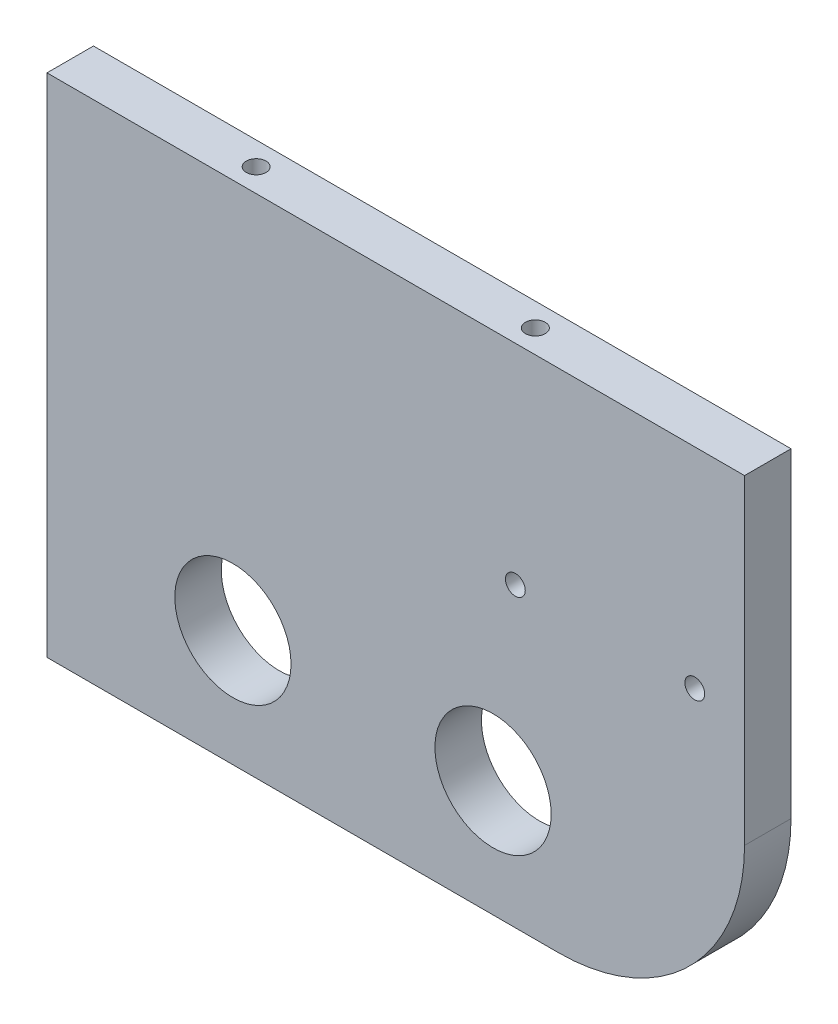
ISO-10303-21;
HEADER;
FILE_DESCRIPTION(('STEP AP214'),'2;1');
FILE_NAME('part.step','',(''),(''),'','','');
FILE_SCHEMA(('AUTOMOTIVE_DESIGN { 1 0 10303 214 1 1 1 1 }'));
ENDSEC;
DATA;
#1=APPLICATION_CONTEXT('core data for automotive mechanical design processes');
#2=APPLICATION_PROTOCOL_DEFINITION('international standard','automotive_design',2000,#1);
#3=PRODUCT_CONTEXT('',#1,'mechanical');
#4=PRODUCT('Part','Part','',(#3));
#5=PRODUCT_RELATED_PRODUCT_CATEGORY('part','',(#4));
#6=PRODUCT_DEFINITION_FORMATION('','',#4);
#7=PRODUCT_DEFINITION_CONTEXT('part definition',#1,'design');
#8=PRODUCT_DEFINITION('design','',#6,#7);
#9=PRODUCT_DEFINITION_SHAPE('','',#8);
#10=(LENGTH_UNIT() NAMED_UNIT(*) SI_UNIT(.MILLI.,.METRE.));
#11=(NAMED_UNIT(*) PLANE_ANGLE_UNIT() SI_UNIT($,.RADIAN.));
#12=(NAMED_UNIT(*) SI_UNIT($,.STERADIAN.) SOLID_ANGLE_UNIT());
#13=UNCERTAINTY_MEASURE_WITH_UNIT(LENGTH_MEASURE(1.E-05),#10,'distance_accuracy_value','');
#14=(GEOMETRIC_REPRESENTATION_CONTEXT(3) GLOBAL_UNCERTAINTY_ASSIGNED_CONTEXT((#13)) GLOBAL_UNIT_ASSIGNED_CONTEXT((#10,
#11,#12)) REPRESENTATION_CONTEXT('',''));
#15=CARTESIAN_POINT('',(0.,0.,0.));
#16=DIRECTION('',(0.,0.,1.));
#17=DIRECTION('',(1.,0.,0.));
#18=AXIS2_PLACEMENT_3D('',#15,#16,#17);
#19=CARTESIAN_POINT('',(-60.9331378268646,-15.875,-101.389403682228));
#20=DIRECTION('',(0.,-1.,0.));
#21=DIRECTION('',(0.,0.,-1.));
#22=AXIS2_PLACEMENT_3D('',#19,#20,#21);
#23=PLANE('',#22);
#24=DIRECTION('',(1.,0.,0.));
#25=VECTOR('',#24,1.);
#26=CARTESIAN_POINT('',(-60.9331378268646,-15.875,-101.389403682228));
#27=LINE('',#26,#25);
#28=CARTESIAN_POINT('',(-60.9331378268646,-15.875,-101.389403682228));
#29=VERTEX_POINT('',#28);
#30=CARTESIAN_POINT('',(8.954322218472,-15.875,-101.389403682228));
#31=VERTEX_POINT('',#30);
#32=EDGE_CURVE('E153',#29,#31,#27,.T.);
#33=ORIENTED_EDGE('',*,*,#32,.T.);
#34=DIRECTION('',(0.,0.,1.));
#35=VECTOR('',#34,1.);
#36=CARTESIAN_POINT('',(8.954322218472,-15.875,-101.389403682228));
#37=LINE('',#36,#35);
#38=CARTESIAN_POINT('',(8.954322218472,-15.875,-95.0394036822282));
#39=VERTEX_POINT('',#38);
#40=EDGE_CURVE('E176',#31,#39,#37,.T.);
#41=ORIENTED_EDGE('',*,*,#40,.T.);
#42=DIRECTION('',(1.,0.,0.));
#43=VECTOR('',#42,1.);
#44=CARTESIAN_POINT('',(-60.9331378268646,-15.875,-95.0394036822282));
#45=LINE('',#44,#43);
#46=CARTESIAN_POINT('',(-60.9331378268646,-15.875,-95.0394036822282));
#47=VERTEX_POINT('',#46);
#48=EDGE_CURVE('E150',#47,#39,#45,.T.);
#49=ORIENTED_EDGE('',*,*,#48,.F.);
#50=DIRECTION('',(0.,0.,1.));
#51=VECTOR('',#50,1.);
#52=CARTESIAN_POINT('',(-60.9331378268646,-15.875,-101.389403682228));
#53=LINE('',#52,#51);
#54=EDGE_CURVE('E174',#29,#47,#53,.T.);
#55=ORIENTED_EDGE('',*,*,#54,.F.);
#56=EDGE_LOOP('',(#33,#41,#49,#55));
#57=FACE_BOUND('',#56,.T.);
#58=ADVANCED_FACE('F40',(#57),#23,.T.);
#59=CARTESIAN_POINT('',(-60.9331378268646,-15.875,-101.389403682228));
#60=DIRECTION('',(-1.,0.,0.));
#61=DIRECTION('',(0.,0.,1.));
#62=AXIS2_PLACEMENT_3D('',#59,#60,#61);
#63=PLANE('',#62);
#64=CARTESIAN_POINT('',(-60.9331378268646,45.340967801772,-98.2144036822282));
#65=DIRECTION('',(-1.,0.,0.));
#66=DIRECTION('',(0.,0.,1.));
#67=AXIS2_PLACEMENT_3D('',#64,#65,#66);
#68=CIRCLE('',#67,1.35254999999999);
#69=CARTESIAN_POINT('',(-60.9331378268646,45.340967801772,-96.8618536822282));
#70=VERTEX_POINT('',#69);
#71=EDGE_CURVE('E106',#70,#70,#68,.T.);
#72=ORIENTED_EDGE('',*,*,#71,.F.);
#73=EDGE_LOOP('',(#72));
#74=FACE_BOUND('',#73,.T.);
#75=CARTESIAN_POINT('',(-60.9331378268646,6.35,-98.2144036822282));
#76=DIRECTION('',(-1.,0.,0.));
#77=DIRECTION('',(0.,0.,1.));
#78=AXIS2_PLACEMENT_3D('',#75,#76,#77);
#79=CIRCLE('',#78,1.35254999999999);
#80=CARTESIAN_POINT('',(-60.9331378268646,6.35,-96.8618536822282));
#81=VERTEX_POINT('',#80);
#82=EDGE_CURVE('E105',#81,#81,#79,.T.);
#83=ORIENTED_EDGE('',*,*,#82,.F.);
#84=EDGE_LOOP('',(#83));
#85=FACE_BOUND('',#84,.T.);
#86=DIRECTION('',(0.,-1.,0.));
#87=VECTOR('',#86,1.);
#88=CARTESIAN_POINT('',(-60.9331378268646,-15.875,-95.0394036822282));
#89=LINE('',#88,#87);
#90=CARTESIAN_POINT('',(-60.9331378268646,53.278467801772,-95.0394036822282));
#91=VERTEX_POINT('',#90);
#92=EDGE_CURVE('E157',#91,#47,#89,.T.);
#93=ORIENTED_EDGE('',*,*,#92,.F.);
#94=DIRECTION('',(0.,0.,1.));
#95=VECTOR('',#94,1.);
#96=CARTESIAN_POINT('',(-60.9331378268646,53.278467801772,-101.389403682228));
#97=LINE('',#96,#95);
#98=CARTESIAN_POINT('',(-60.9331378268646,53.278467801772,-101.389403682228));
#99=VERTEX_POINT('',#98);
#100=EDGE_CURVE('E177',#99,#91,#97,.T.);
#101=ORIENTED_EDGE('',*,*,#100,.F.);
#102=DIRECTION('',(0.,-1.,0.));
#103=VECTOR('',#102,1.);
#104=CARTESIAN_POINT('',(-60.9331378268646,-15.875,-101.389403682228));
#105=LINE('',#104,#103);
#106=EDGE_CURVE('E162',#99,#29,#105,.T.);
#107=ORIENTED_EDGE('',*,*,#106,.T.);
#108=ORIENTED_EDGE('',*,*,#54,.T.);
#109=EDGE_LOOP('',(#93,#101,#107,#108));
#110=FACE_BOUND('',#109,.T.);
#111=ADVANCED_FACE('F193',(#74,#85,#110),#63,.T.);
#112=CARTESIAN_POINT('',(-60.9331378268646,53.278467801772,-101.389403682228));
#113=DIRECTION('',(0.,1.,0.));
#114=DIRECTION('',(0.,0.,1.));
#115=AXIS2_PLACEMENT_3D('',#112,#113,#114);
#116=PLANE('',#115);
#117=CARTESIAN_POINT('',(-35.5331378268646,53.278467801772,-98.2144036822282));
#118=DIRECTION('',(0.,1.,0.));
#119=DIRECTION('',(0.,0.,1.));
#120=AXIS2_PLACEMENT_3D('',#117,#118,#119);
#121=CIRCLE('',#120,1.35254999999999);
#122=CARTESIAN_POINT('',(-35.5331378268646,53.278467801772,-96.8618536822282));
#123=VERTEX_POINT('',#122);
#124=EDGE_CURVE('E116',#123,#123,#121,.T.);
#125=ORIENTED_EDGE('',*,*,#124,.F.);
#126=EDGE_LOOP('',(#125));
#127=FACE_BOUND('',#126,.T.);
#128=CARTESIAN_POINT('',(2.604322218472,53.278467801772,-98.2144036822282));
#129=DIRECTION('',(0.,1.,0.));
#130=DIRECTION('',(0.,0.,1.));
#131=AXIS2_PLACEMENT_3D('',#128,#129,#130);
#132=CIRCLE('',#131,1.35254999999999);
#133=CARTESIAN_POINT('',(2.604322218472,53.278467801772,-96.8618536822282));
#134=VERTEX_POINT('',#133);
#135=EDGE_CURVE('E122',#134,#134,#132,.T.);
#136=ORIENTED_EDGE('',*,*,#135,.F.);
#137=EDGE_LOOP('',(#136));
#138=FACE_BOUND('',#137,.T.);
#139=DIRECTION('',(-1.,0.,0.));
#140=VECTOR('',#139,1.);
#141=CARTESIAN_POINT('',(-60.9331378268646,53.278467801772,-95.0394036822282));
#142=LINE('',#141,#140);
#143=CARTESIAN_POINT('',(34.354322218472,53.278467801772,-95.0394036822282));
#144=VERTEX_POINT('',#143);
#145=EDGE_CURVE('E169',#144,#91,#142,.T.);
#146=ORIENTED_EDGE('',*,*,#145,.F.);
#147=DIRECTION('',(0.,0.,1.));
#148=VECTOR('',#147,1.);
#149=CARTESIAN_POINT('',(34.354322218472,53.278467801772,-101.389403682228));
#150=LINE('',#149,#148);
#151=CARTESIAN_POINT('',(34.354322218472,53.278467801772,-101.389403682228));
#152=VERTEX_POINT('',#151);
#153=EDGE_CURVE('E165',#152,#144,#150,.T.);
#154=ORIENTED_EDGE('',*,*,#153,.F.);
#155=DIRECTION('',(-1.,0.,0.));
#156=VECTOR('',#155,1.);
#157=CARTESIAN_POINT('',(-60.9331378268646,53.278467801772,-101.389403682228));
#158=LINE('',#157,#156);
#159=EDGE_CURVE('E159',#152,#99,#158,.T.);
#160=ORIENTED_EDGE('',*,*,#159,.T.);
#161=ORIENTED_EDGE('',*,*,#100,.T.);
#162=EDGE_LOOP('',(#146,#154,#160,#161));
#163=FACE_BOUND('',#162,.T.);
#164=ADVANCED_FACE('F215',(#127,#138,#163),#116,.T.);
#165=CARTESIAN_POINT('',(34.354322218472,-15.875,-101.389403682228));
#166=DIRECTION('',(1.,0.,0.));
#167=DIRECTION('',(0.,0.,-1.));
#168=AXIS2_PLACEMENT_3D('',#165,#166,#167);
#169=PLANE('',#168);
#170=DIRECTION('',(0.,1.,0.));
#171=VECTOR('',#170,1.);
#172=CARTESIAN_POINT('',(34.354322218472,-15.875,-95.0394036822282));
#173=LINE('',#172,#171);
#174=CARTESIAN_POINT('',(34.354322218472,9.525,-95.0394036822282));
#175=VERTEX_POINT('',#174);
#176=EDGE_CURVE('E167',#175,#144,#173,.T.);
#177=ORIENTED_EDGE('',*,*,#176,.F.);
#178=DIRECTION('',(0.,0.,1.));
#179=VECTOR('',#178,1.);
#180=CARTESIAN_POINT('',(34.354322218472,9.525,-101.389403682228));
#181=LINE('',#180,#179);
#182=CARTESIAN_POINT('',(34.354322218472,9.525,-101.389403682228));
#183=VERTEX_POINT('',#182);
#184=EDGE_CURVE('E48',#175,#183,#181,.F.);
#185=ORIENTED_EDGE('',*,*,#184,.T.);
#186=DIRECTION('',(0.,1.,0.));
#187=VECTOR('',#186,1.);
#188=CARTESIAN_POINT('',(34.354322218472,-15.875,-101.389403682228));
#189=LINE('',#188,#187);
#190=EDGE_CURVE('E156',#183,#152,#189,.T.);
#191=ORIENTED_EDGE('',*,*,#190,.T.);
#192=ORIENTED_EDGE('',*,*,#153,.T.);
#193=EDGE_LOOP('',(#177,#185,#191,#192));
#194=FACE_BOUND('',#193,.T.);
#195=ADVANCED_FACE('F219',(#194),#169,.T.);
#196=CARTESIAN_POINT('',(0.,0.,-101.389403682228));
#197=DIRECTION('',(0.,0.,1.));
#198=DIRECTION('',(1.,0.,0.));
#199=AXIS2_PLACEMENT_3D('',#196,#197,#198);
#200=PLANE('',#199);
#201=CARTESIAN_POINT('',(27.559822218472,24.703467801772,-101.389403682228));
#202=DIRECTION('',(0.,0.,1.));
#203=DIRECTION('',(1.,0.,0.));
#204=AXIS2_PLACEMENT_3D('',#201,#202,#203);
#205=CIRCLE('',#204,1.35254999999999);
#206=CARTESIAN_POINT('',(28.912372218472,24.703467801772,-101.389403682228));
#207=VERTEX_POINT('',#206);
#208=EDGE_CURVE('E131',#207,#207,#205,.T.);
#209=ORIENTED_EDGE('',*,*,#208,.T.);
#210=EDGE_LOOP('',(#209));
#211=FACE_BOUND('',#210,.T.);
#212=CARTESIAN_POINT('',(3.04882221847201,24.703467801772,-101.389403682228));
#213=DIRECTION('',(0.,0.,1.));
#214=DIRECTION('',(1.,0.,0.));
#215=AXIS2_PLACEMENT_3D('',#212,#213,#214);
#216=CIRCLE('',#215,1.35254999999999);
#217=CARTESIAN_POINT('',(4.401372218472,24.703467801772,-101.389403682228));
#218=VERTEX_POINT('',#217);
#219=EDGE_CURVE('E137',#218,#218,#216,.T.);
#220=ORIENTED_EDGE('',*,*,#219,.T.);
#221=EDGE_LOOP('',(#220));
#222=FACE_BOUND('',#221,.T.);
#223=CARTESIAN_POINT('',(-35.5331378268646,0.,-101.389403682228));
#224=DIRECTION('',(0.,0.,1.));
#225=DIRECTION('',(1.,0.,0.));
#226=AXIS2_PLACEMENT_3D('',#223,#224,#225);
#227=CIRCLE('',#226,7.9375);
#228=CARTESIAN_POINT('',(-27.5956378268646,0.,-101.389403682228));
#229=VERTEX_POINT('',#228);
#230=EDGE_CURVE('E141',#229,#229,#227,.T.);
#231=ORIENTED_EDGE('',*,*,#230,.T.);
#232=EDGE_LOOP('',(#231));
#233=FACE_BOUND('',#232,.T.);
#234=CARTESIAN_POINT('',(0.,0.,-101.389403682228));
#235=DIRECTION('',(0.,0.,1.));
#236=DIRECTION('',(1.,0.,0.));
#237=AXIS2_PLACEMENT_3D('',#234,#235,#236);
#238=CIRCLE('',#237,7.9375);
#239=CARTESIAN_POINT('',(7.9375,0.,-101.389403682228));
#240=VERTEX_POINT('',#239);
#241=EDGE_CURVE('E147',#240,#240,#238,.T.);
#242=ORIENTED_EDGE('',*,*,#241,.T.);
#243=EDGE_LOOP('',(#242));
#244=FACE_BOUND('',#243,.T.);
#245=ORIENTED_EDGE('',*,*,#190,.F.);
#246=CARTESIAN_POINT('',(8.954322218472,9.525,-101.389403682228));
#247=DIRECTION('',(0.,0.,1.));
#248=DIRECTION('',(1.,0.,0.));
#249=AXIS2_PLACEMENT_3D('',#246,#247,#248);
#250=CIRCLE('',#249,25.4);
#251=EDGE_CURVE('E11',#183,#31,#250,.F.);
#252=ORIENTED_EDGE('',*,*,#251,.T.);
#253=ORIENTED_EDGE('',*,*,#32,.F.);
#254=ORIENTED_EDGE('',*,*,#106,.F.);
#255=ORIENTED_EDGE('',*,*,#159,.F.);
#256=EDGE_LOOP('',(#245,#252,#253,#254,#255));
#257=FACE_BOUND('',#256,.T.);
#258=ADVANCED_FACE('F196',(#211,#222,#233,#244,#257),#200,.F.);
#259=CARTESIAN_POINT('',(0.,0.,-95.0394036822282));
#260=DIRECTION('',(0.,0.,1.));
#261=DIRECTION('',(1.,0.,0.));
#262=AXIS2_PLACEMENT_3D('',#259,#260,#261);
#263=PLANE('',#262);
#264=CARTESIAN_POINT('',(27.559822218472,24.703467801772,-95.0394036822282));
#265=DIRECTION('',(0.,0.,1.));
#266=DIRECTION('',(1.,0.,0.));
#267=AXIS2_PLACEMENT_3D('',#264,#265,#266);
#268=CIRCLE('',#267,1.35254999999999);
#269=CARTESIAN_POINT('',(28.912372218472,24.703467801772,-95.0394036822282));
#270=VERTEX_POINT('',#269);
#271=EDGE_CURVE('E128',#270,#270,#268,.T.);
#272=ORIENTED_EDGE('',*,*,#271,.F.);
#273=EDGE_LOOP('',(#272));
#274=FACE_BOUND('',#273,.T.);
#275=CARTESIAN_POINT('',(3.04882221847201,24.703467801772,-95.0394036822282));
#276=DIRECTION('',(0.,0.,1.));
#277=DIRECTION('',(1.,0.,0.));
#278=AXIS2_PLACEMENT_3D('',#275,#276,#277);
#279=CIRCLE('',#278,1.35254999999999);
#280=CARTESIAN_POINT('',(4.401372218472,24.703467801772,-95.0394036822282));
#281=VERTEX_POINT('',#280);
#282=EDGE_CURVE('E134',#281,#281,#279,.T.);
#283=ORIENTED_EDGE('',*,*,#282,.F.);
#284=EDGE_LOOP('',(#283));
#285=FACE_BOUND('',#284,.T.);
#286=CARTESIAN_POINT('',(-35.5331378268646,0.,-95.0394036822282));
#287=DIRECTION('',(0.,0.,1.));
#288=DIRECTION('',(1.,0.,0.));
#289=AXIS2_PLACEMENT_3D('',#286,#287,#288);
#290=CIRCLE('',#289,7.9375);
#291=CARTESIAN_POINT('',(-27.5956378268646,0.,-95.0394036822282));
#292=VERTEX_POINT('',#291);
#293=EDGE_CURVE('E140',#292,#292,#290,.T.);
#294=ORIENTED_EDGE('',*,*,#293,.F.);
#295=EDGE_LOOP('',(#294));
#296=FACE_BOUND('',#295,.T.);
#297=CARTESIAN_POINT('',(0.,0.,-95.0394036822282));
#298=DIRECTION('',(0.,0.,1.));
#299=DIRECTION('',(1.,0.,0.));
#300=AXIS2_PLACEMENT_3D('',#297,#298,#299);
#301=CIRCLE('',#300,7.9375);
#302=CARTESIAN_POINT('',(7.9375,0.,-95.0394036822282));
#303=VERTEX_POINT('',#302);
#304=EDGE_CURVE('E144',#303,#303,#301,.T.);
#305=ORIENTED_EDGE('',*,*,#304,.F.);
#306=EDGE_LOOP('',(#305));
#307=FACE_BOUND('',#306,.T.);
#308=ORIENTED_EDGE('',*,*,#48,.T.);
#309=CARTESIAN_POINT('',(8.954322218472,9.525,-95.0394036822282));
#310=DIRECTION('',(0.,0.,1.));
#311=DIRECTION('',(1.,0.,0.));
#312=AXIS2_PLACEMENT_3D('',#309,#310,#311);
#313=CIRCLE('',#312,25.4);
#314=EDGE_CURVE('E62',#39,#175,#313,.T.);
#315=ORIENTED_EDGE('',*,*,#314,.T.);
#316=ORIENTED_EDGE('',*,*,#176,.T.);
#317=ORIENTED_EDGE('',*,*,#145,.T.);
#318=ORIENTED_EDGE('',*,*,#92,.T.);
#319=EDGE_LOOP('',(#308,#315,#316,#317,#318));
#320=FACE_BOUND('',#319,.T.);
#321=ADVANCED_FACE('F189',(#274,#285,#296,#307,#320),#263,.T.);
#322=CARTESIAN_POINT('',(0.,0.,-101.389403682228));
#323=DIRECTION('',(0.,0.,1.));
#324=DIRECTION('',(1.,0.,0.));
#325=AXIS2_PLACEMENT_3D('',#322,#323,#324);
#326=CYLINDRICAL_SURFACE('',#325,7.9375);
#327=ORIENTED_EDGE('',*,*,#241,.F.);
#328=EDGE_LOOP('',(#327));
#329=FACE_BOUND('',#328,.T.);
#330=ORIENTED_EDGE('',*,*,#304,.T.);
#331=EDGE_LOOP('',(#330));
#332=FACE_BOUND('',#331,.T.);
#333=ADVANCED_FACE('F208',(#329,#332),#326,.F.);
#334=CARTESIAN_POINT('',(-35.5331378268646,0.,-101.389403682228));
#335=DIRECTION('',(0.,0.,1.));
#336=DIRECTION('',(1.,0.,0.));
#337=AXIS2_PLACEMENT_3D('',#334,#335,#336);
#338=CYLINDRICAL_SURFACE('',#337,7.9375);
#339=ORIENTED_EDGE('',*,*,#230,.F.);
#340=EDGE_LOOP('',(#339));
#341=FACE_BOUND('',#340,.T.);
#342=ORIENTED_EDGE('',*,*,#293,.T.);
#343=EDGE_LOOP('',(#342));
#344=FACE_BOUND('',#343,.T.);
#345=ADVANCED_FACE('F200',(#341,#344),#338,.F.);
#346=CARTESIAN_POINT('',(8.954322218472,9.525,-101.389403682228));
#347=DIRECTION('',(0.,0.,1.));
#348=DIRECTION('',(1.,0.,0.));
#349=AXIS2_PLACEMENT_3D('',#346,#347,#348);
#350=CYLINDRICAL_SURFACE('',#349,25.4);
#351=ORIENTED_EDGE('',*,*,#251,.F.);
#352=ORIENTED_EDGE('',*,*,#184,.F.);
#353=ORIENTED_EDGE('',*,*,#314,.F.);
#354=ORIENTED_EDGE('',*,*,#40,.F.);
#355=EDGE_LOOP('',(#351,#352,#353,#354));
#356=FACE_BOUND('',#355,.T.);
#357=ADVANCED_FACE('F42',(#356),#350,.T.);
#358=CARTESIAN_POINT('',(3.04882221847201,24.703467801772,-95.0394036822282));
#359=DIRECTION('',(0.,0.,1.));
#360=DIRECTION('',(1.,0.,0.));
#361=AXIS2_PLACEMENT_3D('',#358,#359,#360);
#362=CYLINDRICAL_SURFACE('',#361,1.35254999999999);
#363=ORIENTED_EDGE('',*,*,#282,.T.);
#364=EDGE_LOOP('',(#363));
#365=FACE_BOUND('',#364,.T.);
#366=ORIENTED_EDGE('',*,*,#219,.F.);
#367=EDGE_LOOP('',(#366));
#368=FACE_BOUND('',#367,.T.);
#369=ADVANCED_FACE('F199',(#365,#368),#362,.F.);
#370=CARTESIAN_POINT('',(27.559822218472,24.703467801772,-95.0394036822282));
#371=DIRECTION('',(0.,0.,1.));
#372=DIRECTION('',(1.,0.,0.));
#373=AXIS2_PLACEMENT_3D('',#370,#371,#372);
#374=CYLINDRICAL_SURFACE('',#373,1.35254999999999);
#375=ORIENTED_EDGE('',*,*,#271,.T.);
#376=EDGE_LOOP('',(#375));
#377=FACE_BOUND('',#376,.T.);
#378=ORIENTED_EDGE('',*,*,#208,.F.);
#379=EDGE_LOOP('',(#378));
#380=FACE_BOUND('',#379,.T.);
#381=ADVANCED_FACE('F205',(#377,#380),#374,.F.);
#382=CARTESIAN_POINT('',(2.604322218472,43.8804678017719,-98.2144036822282));
#383=DIRECTION('',(0.,1.,0.));
#384=DIRECTION('',(0.,0.,1.));
#385=AXIS2_PLACEMENT_3D('',#382,#383,#384);
#386=CONICAL_SURFACE('',#385,1.35255,1.02974425867665);
#387=CARTESIAN_POINT('',(2.604322218472,43.0677737715062,-98.2144036822282));
#388=VERTEX_POINT('',#387);
#389=VERTEX_LOOP('',#388);
#390=FACE_BOUND('',#389,.T.);
#391=CARTESIAN_POINT('',(2.604322218472,43.8804678017719,-98.2144036822282));
#392=DIRECTION('',(0.,1.,0.));
#393=DIRECTION('',(0.,0.,1.));
#394=AXIS2_PLACEMENT_3D('',#391,#392,#393);
#395=CIRCLE('',#394,1.35255);
#396=CARTESIAN_POINT('',(2.604322218472,43.8804678017719,-96.8618536822282));
#397=VERTEX_POINT('',#396);
#398=EDGE_CURVE('E125',#397,#397,#395,.T.);
#399=ORIENTED_EDGE('',*,*,#398,.T.);
#400=EDGE_LOOP('',(#399));
#401=FACE_BOUND('',#400,.T.);
#402=ADVANCED_FACE('F236',(#390,#401),#386,.F.);
#403=CARTESIAN_POINT('',(2.604322218472,53.278467801772,-98.2144036822282));
#404=DIRECTION('',(0.,1.,0.));
#405=DIRECTION('',(0.,0.,1.));
#406=AXIS2_PLACEMENT_3D('',#403,#404,#405);
#407=CYLINDRICAL_SURFACE('',#406,1.35254999999999);
#408=ORIENTED_EDGE('',*,*,#398,.F.);
#409=EDGE_LOOP('',(#408));
#410=FACE_BOUND('',#409,.T.);
#411=ORIENTED_EDGE('',*,*,#135,.T.);
#412=EDGE_LOOP('',(#411));
#413=FACE_BOUND('',#412,.T.);
#414=ADVANCED_FACE('F240',(#410,#413),#407,.F.);
#415=CARTESIAN_POINT('',(-35.5331378268646,43.8804678017719,-98.2144036822282));
#416=DIRECTION('',(0.,1.,0.));
#417=DIRECTION('',(0.,0.,1.));
#418=AXIS2_PLACEMENT_3D('',#415,#416,#417);
#419=CONICAL_SURFACE('',#418,1.35255,1.02974425867666);
#420=CARTESIAN_POINT('',(-35.5331378268646,43.0677737715062,-98.2144036822282));
#421=VERTEX_POINT('',#420);
#422=VERTEX_LOOP('',#421);
#423=FACE_BOUND('',#422,.T.);
#424=CARTESIAN_POINT('',(-35.5331378268646,43.8804678017719,-98.2144036822282));
#425=DIRECTION('',(0.,1.,0.));
#426=DIRECTION('',(0.,0.,1.));
#427=AXIS2_PLACEMENT_3D('',#424,#425,#426);
#428=CIRCLE('',#427,1.35255);
#429=CARTESIAN_POINT('',(-35.5331378268646,43.8804678017719,-96.8618536822282));
#430=VERTEX_POINT('',#429);
#431=EDGE_CURVE('E119',#430,#430,#428,.T.);
#432=ORIENTED_EDGE('',*,*,#431,.T.);
#433=EDGE_LOOP('',(#432));
#434=FACE_BOUND('',#433,.T.);
#435=ADVANCED_FACE('F244',(#423,#434),#419,.F.);
#436=CARTESIAN_POINT('',(-35.5331378268646,53.278467801772,-98.2144036822282));
#437=DIRECTION('',(0.,1.,0.));
#438=DIRECTION('',(0.,0.,1.));
#439=AXIS2_PLACEMENT_3D('',#436,#437,#438);
#440=CYLINDRICAL_SURFACE('',#439,1.35254999999999);
#441=ORIENTED_EDGE('',*,*,#431,.F.);
#442=EDGE_LOOP('',(#441));
#443=FACE_BOUND('',#442,.T.);
#444=ORIENTED_EDGE('',*,*,#124,.T.);
#445=EDGE_LOOP('',(#444));
#446=FACE_BOUND('',#445,.T.);
#447=ADVANCED_FACE('F248',(#443,#446),#440,.F.);
#448=CARTESIAN_POINT('',(-51.5351378268645,6.35,-98.2144036822282));
#449=DIRECTION('',(-1.,0.,0.));
#450=DIRECTION('',(0.,0.,1.));
#451=AXIS2_PLACEMENT_3D('',#448,#449,#450);
#452=CONICAL_SURFACE('',#451,1.35254999999999,1.02974425867665);
#453=CARTESIAN_POINT('',(-50.7224437965988,6.35,-98.2144036822282));
#454=VERTEX_POINT('',#453);
#455=VERTEX_LOOP('',#454);
#456=FACE_BOUND('',#455,.T.);
#457=CARTESIAN_POINT('',(-51.5351378268645,6.35,-98.2144036822282));
#458=DIRECTION('',(-1.,0.,0.));
#459=DIRECTION('',(0.,0.,1.));
#460=AXIS2_PLACEMENT_3D('',#457,#458,#459);
#461=CIRCLE('',#460,1.35254999999999);
#462=CARTESIAN_POINT('',(-51.5351378268645,6.35,-96.8618536822282));
#463=VERTEX_POINT('',#462);
#464=EDGE_CURVE('E109',#463,#463,#461,.T.);
#465=ORIENTED_EDGE('',*,*,#464,.T.);
#466=EDGE_LOOP('',(#465));
#467=FACE_BOUND('',#466,.T.);
#468=ADVANCED_FACE('F252',(#456,#467),#452,.F.);
#469=CARTESIAN_POINT('',(-60.9331378268646,6.35,-98.2144036822282));
#470=DIRECTION('',(-1.,0.,0.));
#471=DIRECTION('',(0.,0.,1.));
#472=AXIS2_PLACEMENT_3D('',#469,#470,#471);
#473=CYLINDRICAL_SURFACE('',#472,1.35254999999999);
#474=ORIENTED_EDGE('',*,*,#464,.F.);
#475=EDGE_LOOP('',(#474));
#476=FACE_BOUND('',#475,.T.);
#477=ORIENTED_EDGE('',*,*,#82,.T.);
#478=EDGE_LOOP('',(#477));
#479=FACE_BOUND('',#478,.T.);
#480=ADVANCED_FACE('F99',(#476,#479),#473,.F.);
#481=CARTESIAN_POINT('',(-51.5351378268645,45.340967801772,-98.2144036822282));
#482=DIRECTION('',(-1.,0.,0.));
#483=DIRECTION('',(0.,0.,1.));
#484=AXIS2_PLACEMENT_3D('',#481,#482,#483);
#485=CONICAL_SURFACE('',#484,1.35254999999999,1.02974425867665);
#486=CARTESIAN_POINT('',(-50.7224437965988,45.340967801772,-98.2144036822282));
#487=VERTEX_POINT('',#486);
#488=VERTEX_LOOP('',#487);
#489=FACE_BOUND('',#488,.T.);
#490=CARTESIAN_POINT('',(-51.5351378268645,45.340967801772,-98.2144036822282));
#491=DIRECTION('',(-1.,0.,0.));
#492=DIRECTION('',(0.,0.,1.));
#493=AXIS2_PLACEMENT_3D('',#490,#491,#492);
#494=CIRCLE('',#493,1.35254999999999);
#495=CARTESIAN_POINT('',(-51.5351378268645,45.340967801772,-96.8618536822282));
#496=VERTEX_POINT('',#495);
#497=EDGE_CURVE('E103',#496,#496,#494,.T.);
#498=ORIENTED_EDGE('',*,*,#497,.T.);
#499=EDGE_LOOP('',(#498));
#500=FACE_BOUND('',#499,.T.);
#501=ADVANCED_FACE('F95',(#489,#500),#485,.F.);
#502=CARTESIAN_POINT('',(-60.9331378268646,45.340967801772,-98.2144036822282));
#503=DIRECTION('',(-1.,0.,0.));
#504=DIRECTION('',(0.,0.,1.));
#505=AXIS2_PLACEMENT_3D('',#502,#503,#504);
#506=CYLINDRICAL_SURFACE('',#505,1.35254999999999);
#507=ORIENTED_EDGE('',*,*,#497,.F.);
#508=EDGE_LOOP('',(#507));
#509=FACE_BOUND('',#508,.T.);
#510=ORIENTED_EDGE('',*,*,#71,.T.);
#511=EDGE_LOOP('',(#510));
#512=FACE_BOUND('',#511,.T.);
#513=ADVANCED_FACE('F98',(#509,#512),#506,.F.);
#514=CLOSED_SHELL('',(#58,#111,#164,#195,#258,#321,#333,#345,#357,#369,#381,#402,#414,#435,#447,
#468,#480,#501,#513));
#515=MANIFOLD_SOLID_BREP('B2',#514);
#516=ADVANCED_BREP_SHAPE_REPRESENTATION('',(#18,#515),#14);
#517=SHAPE_DEFINITION_REPRESENTATION(#9,#516);
ENDSEC;
END-ISO-10303-21;
